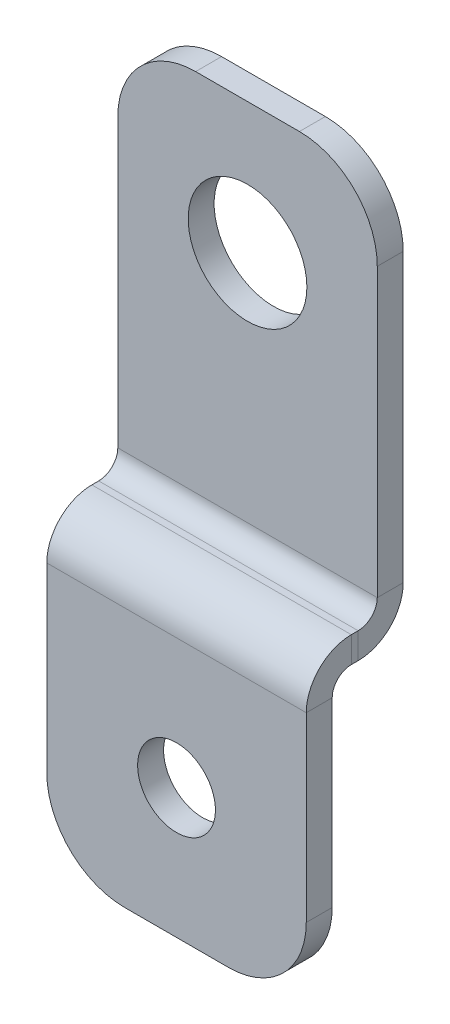
ISO-10303-21;
HEADER;
FILE_DESCRIPTION(('STEP AP214'),'2;1');
FILE_NAME('part.step','',(''),(''),'','','');
FILE_SCHEMA(('AUTOMOTIVE_DESIGN { 1 0 10303 214 1 1 1 1 }'));
ENDSEC;
DATA;
#1=APPLICATION_CONTEXT('core data for automotive mechanical design processes');
#2=APPLICATION_PROTOCOL_DEFINITION('international standard','automotive_design',2000,#1);
#3=PRODUCT_CONTEXT('',#1,'mechanical');
#4=PRODUCT('Part','Part','',(#3));
#5=PRODUCT_RELATED_PRODUCT_CATEGORY('part','',(#4));
#6=PRODUCT_DEFINITION_FORMATION('','',#4);
#7=PRODUCT_DEFINITION_CONTEXT('part definition',#1,'design');
#8=PRODUCT_DEFINITION('design','',#6,#7);
#9=PRODUCT_DEFINITION_SHAPE('','',#8);
#10=(LENGTH_UNIT() NAMED_UNIT(*) SI_UNIT(.MILLI.,.METRE.));
#11=(NAMED_UNIT(*) PLANE_ANGLE_UNIT() SI_UNIT($,.RADIAN.));
#12=(NAMED_UNIT(*) SI_UNIT($,.STERADIAN.) SOLID_ANGLE_UNIT());
#13=UNCERTAINTY_MEASURE_WITH_UNIT(LENGTH_MEASURE(1.E-05),#10,'distance_accuracy_value','');
#14=(GEOMETRIC_REPRESENTATION_CONTEXT(3) GLOBAL_UNCERTAINTY_ASSIGNED_CONTEXT((#13)) GLOBAL_UNIT_ASSIGNED_CONTEXT((#10,
#11,#12)) REPRESENTATION_CONTEXT('',''));
#15=CARTESIAN_POINT('',(0.,0.,0.));
#16=DIRECTION('',(0.,0.,1.));
#17=DIRECTION('',(1.,0.,0.));
#18=AXIS2_PLACEMENT_3D('',#15,#16,#17);
#19=CARTESIAN_POINT('',(0.,0.,1.));
#20=DIRECTION('',(0.,0.,1.));
#21=DIRECTION('',(1.,0.,0.));
#22=AXIS2_PLACEMENT_3D('',#19,#20,#21);
#23=PLANE('',#22);
#24=DIRECTION('',(-1.,0.,0.));
#25=VECTOR('',#24,1.);
#26=CARTESIAN_POINT('',(-514.974194852609,-14.350283508699,1.));
#27=LINE('',#26,#25);
#28=CARTESIAN_POINT('',(-507.974194852609,-14.350283508699,1.));
#29=VERTEX_POINT('',#28);
#30=CARTESIAN_POINT('',(-511.974194852609,-14.350283508699,1.));
#31=VERTEX_POINT('',#30);
#32=EDGE_CURVE('E306',#29,#31,#27,.T.);
#33=ORIENTED_EDGE('',*,*,#32,.T.);
#34=CARTESIAN_POINT('',(-511.974194852609,-17.350283508699,1.));
#35=DIRECTION('',(0.,0.,1.));
#36=DIRECTION('',(1.,0.,0.));
#37=AXIS2_PLACEMENT_3D('',#34,#35,#36);
#38=CIRCLE('',#37,3.);
#39=CARTESIAN_POINT('',(-514.974194852609,-17.350283508699,1.));
#40=VERTEX_POINT('',#39);
#41=EDGE_CURVE('E336',#31,#40,#38,.T.);
#42=ORIENTED_EDGE('',*,*,#41,.T.);
#43=DIRECTION('',(0.,-1.,0.));
#44=VECTOR('',#43,1.);
#45=CARTESIAN_POINT('',(-514.974194852609,-14.350283508699,1.));
#46=LINE('',#45,#44);
#47=CARTESIAN_POINT('',(-514.974194852609,-28.4078112950588,1.));
#48=VERTEX_POINT('',#47);
#49=EDGE_CURVE('E296',#40,#48,#46,.T.);
#50=ORIENTED_EDGE('',*,*,#49,.T.);
#51=DIRECTION('',(1.,0.,0.));
#52=VECTOR('',#51,1.);
#53=CARTESIAN_POINT('',(-514.974194852609,-28.4078112950588,1.));
#54=LINE('',#53,#52);
#55=CARTESIAN_POINT('',(-504.974194852609,-28.4078112950588,1.));
#56=VERTEX_POINT('',#55);
#57=EDGE_CURVE('E297',#48,#56,#54,.T.);
#58=ORIENTED_EDGE('',*,*,#57,.T.);
#59=DIRECTION('',(0.,1.,0.));
#60=VECTOR('',#59,1.);
#61=CARTESIAN_POINT('',(-504.974194852609,-14.350283508699,1.));
#62=LINE('',#61,#60);
#63=CARTESIAN_POINT('',(-504.974194852609,-17.350283508699,1.));
#64=VERTEX_POINT('',#63);
#65=EDGE_CURVE('E303',#56,#64,#62,.T.);
#66=ORIENTED_EDGE('',*,*,#65,.T.);
#67=CARTESIAN_POINT('',(-507.974194852609,-17.350283508699,1.));
#68=DIRECTION('',(0.,0.,1.));
#69=DIRECTION('',(1.,0.,0.));
#70=AXIS2_PLACEMENT_3D('',#67,#68,#69);
#71=CIRCLE('',#70,3.);
#72=EDGE_CURVE('E337',#64,#29,#71,.T.);
#73=ORIENTED_EDGE('',*,*,#72,.T.);
#74=EDGE_LOOP('',(#33,#42,#50,#58,#66,#73));
#75=FACE_BOUND('',#74,.T.);
#76=CARTESIAN_POINT('',(-509.974194852609,-19.4,1.));
#77=DIRECTION('',(0.,0.,1.));
#78=DIRECTION('',(1.,0.,0.));
#79=AXIS2_PLACEMENT_3D('',#76,#77,#78);
#80=CIRCLE('',#79,2.28730752562085);
#81=CARTESIAN_POINT('',(-507.686887326988,-19.4,1.));
#82=VERTEX_POINT('',#81);
#83=EDGE_CURVE('E292',#82,#82,#80,.T.);
#84=ORIENTED_EDGE('',*,*,#83,.F.);
#85=EDGE_LOOP('',(#84));
#86=FACE_BOUND('',#85,.T.);
#87=ADVANCED_FACE('F85',(#75,#86),#23,.T.);
#88=CARTESIAN_POINT('',(0.,0.,0.));
#89=DIRECTION('',(0.,0.,1.));
#90=DIRECTION('',(1.,0.,0.));
#91=AXIS2_PLACEMENT_3D('',#88,#89,#90);
#92=PLANE('',#91);
#93=DIRECTION('',(0.,-1.,0.));
#94=VECTOR('',#93,1.);
#95=CARTESIAN_POINT('',(-514.974194852609,-14.350283508699,0.));
#96=LINE('',#95,#94);
#97=CARTESIAN_POINT('',(-514.974194852609,-17.350283508699,0.));
#98=VERTEX_POINT('',#97);
#99=CARTESIAN_POINT('',(-514.974194852609,-28.4078112950588,0.));
#100=VERTEX_POINT('',#99);
#101=EDGE_CURVE('E294',#98,#100,#96,.T.);
#102=ORIENTED_EDGE('',*,*,#101,.F.);
#103=CARTESIAN_POINT('',(-511.974194852609,-17.350283508699,0.));
#104=DIRECTION('',(0.,0.,1.));
#105=DIRECTION('',(1.,0.,0.));
#106=AXIS2_PLACEMENT_3D('',#103,#104,#105);
#107=CIRCLE('',#106,3.);
#108=CARTESIAN_POINT('',(-511.974194852609,-14.350283508699,0.));
#109=VERTEX_POINT('',#108);
#110=EDGE_CURVE('E326',#98,#109,#107,.F.);
#111=ORIENTED_EDGE('',*,*,#110,.T.);
#112=DIRECTION('',(-1.,0.,0.));
#113=VECTOR('',#112,1.);
#114=CARTESIAN_POINT('',(-514.974194852609,-14.350283508699,0.));
#115=LINE('',#114,#113);
#116=CARTESIAN_POINT('',(-507.974194852609,-14.350283508699,0.));
#117=VERTEX_POINT('',#116);
#118=EDGE_CURVE('E301',#117,#109,#115,.T.);
#119=ORIENTED_EDGE('',*,*,#118,.F.);
#120=CARTESIAN_POINT('',(-507.974194852609,-17.350283508699,0.));
#121=DIRECTION('',(0.,0.,1.));
#122=DIRECTION('',(1.,0.,0.));
#123=AXIS2_PLACEMENT_3D('',#120,#121,#122);
#124=CIRCLE('',#123,3.);
#125=CARTESIAN_POINT('',(-504.974194852609,-17.350283508699,0.));
#126=VERTEX_POINT('',#125);
#127=EDGE_CURVE('E330',#117,#126,#124,.F.);
#128=ORIENTED_EDGE('',*,*,#127,.T.);
#129=DIRECTION('',(0.,1.,0.));
#130=VECTOR('',#129,1.);
#131=CARTESIAN_POINT('',(-504.974194852609,-14.350283508699,0.));
#132=LINE('',#131,#130);
#133=CARTESIAN_POINT('',(-504.974194852609,-28.4078112950588,0.));
#134=VERTEX_POINT('',#133);
#135=EDGE_CURVE('E313',#134,#126,#132,.T.);
#136=ORIENTED_EDGE('',*,*,#135,.F.);
#137=DIRECTION('',(1.,0.,0.));
#138=VECTOR('',#137,1.);
#139=CARTESIAN_POINT('',(-514.974194852609,-28.4078112950588,0.));
#140=LINE('',#139,#138);
#141=EDGE_CURVE('E311',#100,#134,#140,.T.);
#142=ORIENTED_EDGE('',*,*,#141,.F.);
#143=EDGE_LOOP('',(#102,#111,#119,#128,#136,#142));
#144=FACE_BOUND('',#143,.T.);
#145=CARTESIAN_POINT('',(-509.974194852609,-19.4,0.));
#146=DIRECTION('',(0.,0.,1.));
#147=DIRECTION('',(1.,0.,0.));
#148=AXIS2_PLACEMENT_3D('',#145,#146,#147);
#149=CIRCLE('',#148,2.28730752562085);
#150=CARTESIAN_POINT('',(-507.686887326988,-19.4,0.));
#151=VERTEX_POINT('',#150);
#152=EDGE_CURVE('E283',#151,#151,#149,.T.);
#153=ORIENTED_EDGE('',*,*,#152,.T.);
#154=EDGE_LOOP('',(#153));
#155=FACE_BOUND('',#154,.T.);
#156=ADVANCED_FACE('F426',(#144,#155),#92,.F.);
#157=CARTESIAN_POINT('',(-514.974194852609,-14.350283508699,1.));
#158=DIRECTION('',(1.,0.,0.));
#159=DIRECTION('',(0.,0.,-1.));
#160=AXIS2_PLACEMENT_3D('',#157,#158,#159);
#161=PLANE('',#160);
#162=ORIENTED_EDGE('',*,*,#49,.F.);
#163=DIRECTION('',(0.,0.,-1.));
#164=VECTOR('',#163,1.);
#165=CARTESIAN_POINT('',(-514.974194852609,-17.350283508699,1.));
#166=LINE('',#165,#164);
#167=EDGE_CURVE('E323',#40,#98,#166,.T.);
#168=ORIENTED_EDGE('',*,*,#167,.T.);
#169=ORIENTED_EDGE('',*,*,#101,.T.);
#170=DIRECTION('',(0.,0.,-1.));
#171=VECTOR('',#170,1.);
#172=CARTESIAN_POINT('',(-514.974194852609,-28.4078112950588,1.));
#173=LINE('',#172,#171);
#174=EDGE_CURVE('E324',#48,#100,#173,.T.);
#175=ORIENTED_EDGE('',*,*,#174,.F.);
#176=EDGE_LOOP('',(#162,#168,#169,#175));
#177=FACE_BOUND('',#176,.T.);
#178=ADVANCED_FACE('F399',(#177),#161,.F.);
#179=CARTESIAN_POINT('',(-504.974194852609,-14.350283508699,1.));
#180=DIRECTION('',(-1.,0.,0.));
#181=DIRECTION('',(0.,0.,1.));
#182=AXIS2_PLACEMENT_3D('',#179,#180,#181);
#183=PLANE('',#182);
#184=ORIENTED_EDGE('',*,*,#135,.T.);
#185=DIRECTION('',(0.,0.,-1.));
#186=VECTOR('',#185,1.);
#187=CARTESIAN_POINT('',(-504.974194852609,-17.350283508699,1.));
#188=LINE('',#187,#186);
#189=EDGE_CURVE('E338',#126,#64,#188,.F.);
#190=ORIENTED_EDGE('',*,*,#189,.T.);
#191=ORIENTED_EDGE('',*,*,#65,.F.);
#192=DIRECTION('',(0.,0.,-1.));
#193=VECTOR('',#192,1.);
#194=CARTESIAN_POINT('',(-504.974194852609,-28.4078112950588,1.));
#195=LINE('',#194,#193);
#196=EDGE_CURVE('E307',#56,#134,#195,.T.);
#197=ORIENTED_EDGE('',*,*,#196,.T.);
#198=EDGE_LOOP('',(#184,#190,#191,#197));
#199=FACE_BOUND('',#198,.T.);
#200=ADVANCED_FACE('F413',(#199),#183,.F.);
#201=CARTESIAN_POINT('',(-514.974194852609,-14.350283508699,1.));
#202=DIRECTION('',(0.,-1.,0.));
#203=DIRECTION('',(0.,0.,-1.));
#204=AXIS2_PLACEMENT_3D('',#201,#202,#203);
#205=PLANE('',#204);
#206=ORIENTED_EDGE('',*,*,#118,.T.);
#207=DIRECTION('',(0.,0.,-1.));
#208=VECTOR('',#207,1.);
#209=CARTESIAN_POINT('',(-511.974194852609,-14.350283508699,1.));
#210=LINE('',#209,#208);
#211=EDGE_CURVE('E333',#109,#31,#210,.F.);
#212=ORIENTED_EDGE('',*,*,#211,.T.);
#213=ORIENTED_EDGE('',*,*,#32,.F.);
#214=DIRECTION('',(0.,0.,-1.));
#215=VECTOR('',#214,1.);
#216=CARTESIAN_POINT('',(-507.974194852609,-14.350283508699,1.));
#217=LINE('',#216,#215);
#218=EDGE_CURVE('E331',#29,#117,#217,.T.);
#219=ORIENTED_EDGE('',*,*,#218,.T.);
#220=EDGE_LOOP('',(#206,#212,#213,#219));
#221=FACE_BOUND('',#220,.T.);
#222=ADVANCED_FACE('F440',(#221),#205,.F.);
#223=CARTESIAN_POINT('',(-509.974194852609,-19.4,1.));
#224=DIRECTION('',(0.,0.,-1.));
#225=DIRECTION('',(-1.,0.,0.));
#226=AXIS2_PLACEMENT_3D('',#223,#224,#225);
#227=CYLINDRICAL_SURFACE('',#226,2.28730752562085);
#228=ORIENTED_EDGE('',*,*,#83,.T.);
#229=EDGE_LOOP('',(#228));
#230=FACE_BOUND('',#229,.T.);
#231=ORIENTED_EDGE('',*,*,#152,.F.);
#232=EDGE_LOOP('',(#231));
#233=FACE_BOUND('',#232,.T.);
#234=ADVANCED_FACE('F425',(#230,#233),#227,.F.);
#235=CARTESIAN_POINT('',(-514.974194852609,-28.4078112950588,1.7366));
#236=DIRECTION('',(-1.,0.,0.));
#237=DIRECTION('',(0.,0.,1.));
#238=AXIS2_PLACEMENT_3D('',#235,#236,#237);
#239=PLANE('',#238);
#240=DIRECTION('',(0.,1.,0.));
#241=VECTOR('',#240,1.);
#242=CARTESIAN_POINT('',(-514.974194852609,-30.1444112950588,1.73659999999999));
#243=LINE('',#242,#241);
#244=CARTESIAN_POINT('',(-514.974194852609,-29.1444112950588,1.7366));
#245=VERTEX_POINT('',#244);
#246=CARTESIAN_POINT('',(-514.974194852609,-30.1444112950588,1.73659999999999));
#247=VERTEX_POINT('',#246);
#248=EDGE_CURVE('E246',#245,#247,#243,.F.);
#249=ORIENTED_EDGE('',*,*,#248,.F.);
#250=CARTESIAN_POINT('',(-514.974194852609,-28.4078112950588,1.7366));
#251=DIRECTION('',(1.,0.,0.));
#252=DIRECTION('',(0.,0.,-1.));
#253=AXIS2_PLACEMENT_3D('',#250,#251,#252);
#254=CIRCLE('',#253,0.7366);
#255=EDGE_CURVE('E289',#48,#245,#254,.F.);
#256=ORIENTED_EDGE('',*,*,#255,.F.);
#257=ORIENTED_EDGE('',*,*,#174,.T.);
#258=CARTESIAN_POINT('',(-514.974194852609,-28.4078112950588,1.7366));
#259=DIRECTION('',(1.,0.,0.));
#260=DIRECTION('',(0.,0.,-1.));
#261=AXIS2_PLACEMENT_3D('',#258,#259,#260);
#262=CIRCLE('',#261,1.7366);
#263=EDGE_CURVE('E278',#100,#247,#262,.F.);
#264=ORIENTED_EDGE('',*,*,#263,.T.);
#265=EDGE_LOOP('',(#249,#256,#257,#264));
#266=FACE_BOUND('',#265,.T.);
#267=ADVANCED_FACE('F391',(#266),#239,.T.);
#268=CARTESIAN_POINT('',(-504.974194852609,-28.4078112950588,1.7366));
#269=DIRECTION('',(-1.,0.,0.));
#270=DIRECTION('',(0.,0.,1.));
#271=AXIS2_PLACEMENT_3D('',#268,#269,#270);
#272=PLANE('',#271);
#273=CARTESIAN_POINT('',(-504.974194852609,-28.4078112950588,1.7366));
#274=DIRECTION('',(1.,0.,0.));
#275=DIRECTION('',(0.,0.,-1.));
#276=AXIS2_PLACEMENT_3D('',#273,#274,#275);
#277=CIRCLE('',#276,0.7366);
#278=CARTESIAN_POINT('',(-504.974194852609,-29.1444112950588,1.7366));
#279=VERTEX_POINT('',#278);
#280=EDGE_CURVE('E251',#279,#56,#277,.T.);
#281=ORIENTED_EDGE('',*,*,#280,.F.);
#282=DIRECTION('',(0.,1.,0.));
#283=VECTOR('',#282,1.);
#284=CARTESIAN_POINT('',(-504.974194852609,-29.1444112950588,1.7366));
#285=LINE('',#284,#283);
#286=CARTESIAN_POINT('',(-504.974194852609,-30.1444112950588,1.73659999999999));
#287=VERTEX_POINT('',#286);
#288=EDGE_CURVE('E271',#279,#287,#285,.F.);
#289=ORIENTED_EDGE('',*,*,#288,.T.);
#290=CARTESIAN_POINT('',(-504.974194852609,-28.4078112950588,1.7366));
#291=DIRECTION('',(1.,0.,0.));
#292=DIRECTION('',(0.,0.,-1.));
#293=AXIS2_PLACEMENT_3D('',#290,#291,#292);
#294=CIRCLE('',#293,1.7366);
#295=EDGE_CURVE('E284',#287,#134,#294,.T.);
#296=ORIENTED_EDGE('',*,*,#295,.T.);
#297=ORIENTED_EDGE('',*,*,#196,.F.);
#298=EDGE_LOOP('',(#281,#289,#296,#297));
#299=FACE_BOUND('',#298,.T.);
#300=ADVANCED_FACE('F417',(#299),#272,.F.);
#301=CARTESIAN_POINT('',(-504.974194852609,-28.4078112950588,1.7366));
#302=DIRECTION('',(1.,0.,0.));
#303=DIRECTION('',(0.,-1.,0.));
#304=AXIS2_PLACEMENT_3D('',#301,#302,#303);
#305=CYLINDRICAL_SURFACE('',#304,1.7366);
#306=ORIENTED_EDGE('',*,*,#141,.T.);
#307=ORIENTED_EDGE('',*,*,#295,.F.);
#308=DIRECTION('',(1.,0.,0.));
#309=VECTOR('',#308,1.);
#310=CARTESIAN_POINT('',(-514.974194852609,-30.1444112950588,1.73659999999999));
#311=LINE('',#310,#309);
#312=EDGE_CURVE('E272',#287,#247,#311,.F.);
#313=ORIENTED_EDGE('',*,*,#312,.T.);
#314=ORIENTED_EDGE('',*,*,#263,.F.);
#315=EDGE_LOOP('',(#306,#307,#313,#314));
#316=FACE_BOUND('',#315,.T.);
#317=ADVANCED_FACE('F395',(#316),#305,.T.);
#318=CARTESIAN_POINT('',(-504.974194852609,-28.4078112950588,1.7366));
#319=DIRECTION('',(1.,0.,0.));
#320=DIRECTION('',(0.,-1.,0.));
#321=AXIS2_PLACEMENT_3D('',#318,#319,#320);
#322=CYLINDRICAL_SURFACE('',#321,0.7366);
#323=ORIENTED_EDGE('',*,*,#57,.F.);
#324=ORIENTED_EDGE('',*,*,#255,.T.);
#325=DIRECTION('',(1.,0.,0.));
#326=VECTOR('',#325,1.);
#327=CARTESIAN_POINT('',(-514.974194852609,-29.1444112950588,1.7366));
#328=LINE('',#327,#326);
#329=EDGE_CURVE('E277',#245,#279,#328,.T.);
#330=ORIENTED_EDGE('',*,*,#329,.T.);
#331=ORIENTED_EDGE('',*,*,#280,.T.);
#332=EDGE_LOOP('',(#323,#324,#330,#331));
#333=FACE_BOUND('',#332,.T.);
#334=ADVANCED_FACE('F403',(#333),#322,.F.);
#335=CARTESIAN_POINT('',(-514.974194852609,-30.1444112950588,0.999999999999997));
#336=DIRECTION('',(1.,0.,0.));
#337=DIRECTION('',(0.,0.,-1.));
#338=AXIS2_PLACEMENT_3D('',#335,#336,#337);
#339=PLANE('',#338);
#340=ORIENTED_EDGE('',*,*,#248,.T.);
#341=DIRECTION('',(0.,0.,-1.));
#342=VECTOR('',#341,1.);
#343=CARTESIAN_POINT('',(-514.974194852609,-30.1444112950588,-1.02050875648158E-13));
#344=LINE('',#343,#342);
#345=CARTESIAN_POINT('',(-514.974194852609,-30.1444112950588,2.));
#346=VERTEX_POINT('',#345);
#347=EDGE_CURVE('E265',#346,#247,#344,.T.);
#348=ORIENTED_EDGE('',*,*,#347,.F.);
#349=DIRECTION('',(0.,1.,0.));
#350=VECTOR('',#349,1.);
#351=CARTESIAN_POINT('',(-514.974194852609,-30.1444112950588,2.));
#352=LINE('',#351,#350);
#353=CARTESIAN_POINT('',(-514.974194852609,-29.1444112950588,2.));
#354=VERTEX_POINT('',#353);
#355=EDGE_CURVE('E253',#346,#354,#352,.T.);
#356=ORIENTED_EDGE('',*,*,#355,.T.);
#357=DIRECTION('',(0.,0.,1.));
#358=VECTOR('',#357,1.);
#359=CARTESIAN_POINT('',(-514.974194852609,-29.1444112950588,1.));
#360=LINE('',#359,#358);
#361=EDGE_CURVE('E267',#354,#245,#360,.F.);
#362=ORIENTED_EDGE('',*,*,#361,.T.);
#363=EDGE_LOOP('',(#340,#348,#356,#362));
#364=FACE_BOUND('',#363,.T.);
#365=ADVANCED_FACE('F389',(#364),#339,.F.);
#366=CARTESIAN_POINT('',(-504.974194852609,-30.1444112950588,2.));
#367=DIRECTION('',(-1.,0.,0.));
#368=DIRECTION('',(0.,0.,1.));
#369=AXIS2_PLACEMENT_3D('',#366,#367,#368);
#370=PLANE('',#369);
#371=ORIENTED_EDGE('',*,*,#288,.F.);
#372=DIRECTION('',(0.,0.,-1.));
#373=VECTOR('',#372,1.);
#374=CARTESIAN_POINT('',(-504.974194852609,-29.1444112950588,2.));
#375=LINE('',#374,#373);
#376=CARTESIAN_POINT('',(-504.974194852609,-29.1444112950588,2.));
#377=VERTEX_POINT('',#376);
#378=EDGE_CURVE('E266',#279,#377,#375,.F.);
#379=ORIENTED_EDGE('',*,*,#378,.T.);
#380=DIRECTION('',(0.,1.,0.));
#381=VECTOR('',#380,1.);
#382=CARTESIAN_POINT('',(-504.974194852609,-30.1444112950588,2.));
#383=LINE('',#382,#381);
#384=CARTESIAN_POINT('',(-504.974194852609,-30.1444112950588,2.));
#385=VERTEX_POINT('',#384);
#386=EDGE_CURVE('E252',#385,#377,#383,.T.);
#387=ORIENTED_EDGE('',*,*,#386,.F.);
#388=DIRECTION('',(0.,0.,1.));
#389=VECTOR('',#388,1.);
#390=CARTESIAN_POINT('',(-504.974194852609,-30.1444112950588,-1.02050875648158E-13));
#391=LINE('',#390,#389);
#392=EDGE_CURVE('E257',#287,#385,#391,.T.);
#393=ORIENTED_EDGE('',*,*,#392,.F.);
#394=EDGE_LOOP('',(#371,#379,#387,#393));
#395=FACE_BOUND('',#394,.T.);
#396=ADVANCED_FACE('F378',(#395),#370,.F.);
#397=CARTESIAN_POINT('',(0.,-30.1444112950588,-1.02050875648158E-13));
#398=DIRECTION('',(0.,1.,0.));
#399=DIRECTION('',(0.,0.,1.));
#400=AXIS2_PLACEMENT_3D('',#397,#398,#399);
#401=PLANE('',#400);
#402=ORIENTED_EDGE('',*,*,#312,.F.);
#403=ORIENTED_EDGE('',*,*,#392,.T.);
#404=DIRECTION('',(-1.,0.,0.));
#405=VECTOR('',#404,1.);
#406=CARTESIAN_POINT('',(0.,-30.1444112950588,2.));
#407=LINE('',#406,#405);
#408=EDGE_CURVE('E260',#385,#346,#407,.T.);
#409=ORIENTED_EDGE('',*,*,#408,.T.);
#410=ORIENTED_EDGE('',*,*,#347,.T.);
#411=EDGE_LOOP('',(#402,#403,#409,#410));
#412=FACE_BOUND('',#411,.T.);
#413=ADVANCED_FACE('F388',(#412),#401,.F.);
#414=CARTESIAN_POINT('',(0.,-29.1444112950588,0.));
#415=DIRECTION('',(0.,1.,0.));
#416=DIRECTION('',(0.,0.,1.));
#417=AXIS2_PLACEMENT_3D('',#414,#415,#416);
#418=PLANE('',#417);
#419=ORIENTED_EDGE('',*,*,#378,.F.);
#420=ORIENTED_EDGE('',*,*,#329,.F.);
#421=ORIENTED_EDGE('',*,*,#361,.F.);
#422=DIRECTION('',(1.,0.,0.));
#423=VECTOR('',#422,1.);
#424=CARTESIAN_POINT('',(-514.974194852609,-29.1444112950588,2.));
#425=LINE('',#424,#423);
#426=EDGE_CURVE('E207',#377,#354,#425,.F.);
#427=ORIENTED_EDGE('',*,*,#426,.F.);
#428=EDGE_LOOP('',(#419,#420,#421,#427));
#429=FACE_BOUND('',#428,.T.);
#430=ADVANCED_FACE('F384',(#429),#418,.T.);
#431=CARTESIAN_POINT('',(-504.974194852609,-30.8810112950588,2.));
#432=DIRECTION('',(1.,0.,0.));
#433=DIRECTION('',(0.,0.,-1.));
#434=AXIS2_PLACEMENT_3D('',#431,#432,#433);
#435=PLANE('',#434);
#436=DIRECTION('',(0.,0.,-1.));
#437=VECTOR('',#436,1.);
#438=CARTESIAN_POINT('',(-504.974194852609,-30.8810112950588,3.7366));
#439=LINE('',#438,#437);
#440=CARTESIAN_POINT('',(-504.974194852609,-30.8810112950588,2.7366));
#441=VERTEX_POINT('',#440);
#442=CARTESIAN_POINT('',(-504.974194852609,-30.8810112950588,3.7366));
#443=VERTEX_POINT('',#442);
#444=EDGE_CURVE('E245',#441,#443,#439,.F.);
#445=ORIENTED_EDGE('',*,*,#444,.F.);
#446=CARTESIAN_POINT('',(-504.974194852609,-30.8810112950588,2.));
#447=DIRECTION('',(-1.,0.,0.));
#448=DIRECTION('',(0.,0.,1.));
#449=AXIS2_PLACEMENT_3D('',#446,#447,#448);
#450=CIRCLE('',#449,0.7366);
#451=EDGE_CURVE('E208',#385,#441,#450,.F.);
#452=ORIENTED_EDGE('',*,*,#451,.F.);
#453=ORIENTED_EDGE('',*,*,#386,.T.);
#454=CARTESIAN_POINT('',(-504.974194852609,-30.8810112950588,2.));
#455=DIRECTION('',(-1.,0.,0.));
#456=DIRECTION('',(0.,0.,1.));
#457=AXIS2_PLACEMENT_3D('',#454,#455,#456);
#458=CIRCLE('',#457,1.7366);
#459=EDGE_CURVE('E209',#377,#443,#458,.F.);
#460=ORIENTED_EDGE('',*,*,#459,.T.);
#461=EDGE_LOOP('',(#445,#452,#453,#460));
#462=FACE_BOUND('',#461,.T.);
#463=ADVANCED_FACE('F372',(#462),#435,.T.);
#464=CARTESIAN_POINT('',(-514.974194852609,-30.8810112950588,2.));
#465=DIRECTION('',(1.,0.,0.));
#466=DIRECTION('',(0.,0.,-1.));
#467=AXIS2_PLACEMENT_3D('',#464,#465,#466);
#468=PLANE('',#467);
#469=CARTESIAN_POINT('',(-514.974194852609,-30.8810112950588,2.));
#470=DIRECTION('',(-1.,0.,0.));
#471=DIRECTION('',(0.,0.,1.));
#472=AXIS2_PLACEMENT_3D('',#469,#470,#471);
#473=CIRCLE('',#472,0.7366);
#474=CARTESIAN_POINT('',(-514.974194852609,-30.8810112950588,2.7366));
#475=VERTEX_POINT('',#474);
#476=EDGE_CURVE('E220',#475,#346,#473,.T.);
#477=ORIENTED_EDGE('',*,*,#476,.F.);
#478=DIRECTION('',(0.,0.,-1.));
#479=VECTOR('',#478,1.);
#480=CARTESIAN_POINT('',(-514.974194852609,-30.8810112950588,2.7366));
#481=LINE('',#480,#479);
#482=CARTESIAN_POINT('',(-514.974194852609,-30.8810112950588,3.7366));
#483=VERTEX_POINT('',#482);
#484=EDGE_CURVE('E211',#475,#483,#481,.F.);
#485=ORIENTED_EDGE('',*,*,#484,.T.);
#486=CARTESIAN_POINT('',(-514.974194852609,-30.8810112950588,2.));
#487=DIRECTION('',(-1.,0.,0.));
#488=DIRECTION('',(0.,0.,1.));
#489=AXIS2_PLACEMENT_3D('',#486,#487,#488);
#490=CIRCLE('',#489,1.7366);
#491=EDGE_CURVE('E199',#483,#354,#490,.T.);
#492=ORIENTED_EDGE('',*,*,#491,.T.);
#493=ORIENTED_EDGE('',*,*,#355,.F.);
#494=EDGE_LOOP('',(#477,#485,#492,#493));
#495=FACE_BOUND('',#494,.T.);
#496=ADVANCED_FACE('F213',(#495),#468,.F.);
#497=CARTESIAN_POINT('',(-514.974194852609,-30.8810112950588,2.));
#498=DIRECTION('',(-1.,0.,0.));
#499=DIRECTION('',(0.,0.,1.));
#500=AXIS2_PLACEMENT_3D('',#497,#498,#499);
#501=CYLINDRICAL_SURFACE('',#500,1.7366);
#502=ORIENTED_EDGE('',*,*,#426,.T.);
#503=ORIENTED_EDGE('',*,*,#491,.F.);
#504=DIRECTION('',(-1.,0.,0.));
#505=VECTOR('',#504,1.);
#506=CARTESIAN_POINT('',(-504.974194852609,-30.8810112950588,3.7366));
#507=LINE('',#506,#505);
#508=EDGE_CURVE('E202',#483,#443,#507,.F.);
#509=ORIENTED_EDGE('',*,*,#508,.T.);
#510=ORIENTED_EDGE('',*,*,#459,.F.);
#511=EDGE_LOOP('',(#502,#503,#509,#510));
#512=FACE_BOUND('',#511,.T.);
#513=ADVANCED_FACE('F198',(#512),#501,.T.);
#514=CARTESIAN_POINT('',(-514.974194852609,-30.8810112950588,2.));
#515=DIRECTION('',(-1.,0.,0.));
#516=DIRECTION('',(0.,0.,1.));
#517=AXIS2_PLACEMENT_3D('',#514,#515,#516);
#518=CYLINDRICAL_SURFACE('',#517,0.7366);
#519=ORIENTED_EDGE('',*,*,#408,.F.);
#520=ORIENTED_EDGE('',*,*,#451,.T.);
#521=DIRECTION('',(-1.,0.,0.));
#522=VECTOR('',#521,1.);
#523=CARTESIAN_POINT('',(-504.974194852609,-30.8810112950588,2.7366));
#524=LINE('',#523,#522);
#525=EDGE_CURVE('E219',#441,#475,#524,.T.);
#526=ORIENTED_EDGE('',*,*,#525,.T.);
#527=ORIENTED_EDGE('',*,*,#476,.T.);
#528=EDGE_LOOP('',(#519,#520,#526,#527));
#529=FACE_BOUND('',#528,.T.);
#530=ADVANCED_FACE('F371',(#529),#518,.F.);
#531=CARTESIAN_POINT('',(-504.974194852609,-30.1444112950588,3.7366));
#532=DIRECTION('',(-1.,0.,0.));
#533=DIRECTION('',(0.,0.,1.));
#534=AXIS2_PLACEMENT_3D('',#531,#532,#533);
#535=PLANE('',#534);
#536=DIRECTION('',(0.,1.,0.));
#537=VECTOR('',#536,1.);
#538=CARTESIAN_POINT('',(-504.974194852609,0.,3.7366));
#539=LINE('',#538,#537);
#540=CARTESIAN_POINT('',(-504.974194852609,-37.8810112950588,3.7366));
#541=VERTEX_POINT('',#540);
#542=EDGE_CURVE('E228',#541,#443,#539,.T.);
#543=ORIENTED_EDGE('',*,*,#542,.F.);
#544=DIRECTION('',(0.,0.,-1.));
#545=VECTOR('',#544,1.);
#546=CARTESIAN_POINT('',(-504.974194852609,-37.8810112950588,3.7366));
#547=LINE('',#546,#545);
#548=CARTESIAN_POINT('',(-504.974194852609,-37.8810112950588,2.7366));
#549=VERTEX_POINT('',#548);
#550=EDGE_CURVE('E345',#541,#549,#547,.T.);
#551=ORIENTED_EDGE('',*,*,#550,.T.);
#552=DIRECTION('',(0.,-1.,0.));
#553=VECTOR('',#552,1.);
#554=CARTESIAN_POINT('',(-504.974194852609,-30.1444112950588,2.7366));
#555=LINE('',#554,#553);
#556=EDGE_CURVE('E227',#549,#441,#555,.F.);
#557=ORIENTED_EDGE('',*,*,#556,.T.);
#558=ORIENTED_EDGE('',*,*,#444,.T.);
#559=EDGE_LOOP('',(#543,#551,#557,#558));
#560=FACE_BOUND('',#559,.T.);
#561=ADVANCED_FACE('F356',(#560),#535,.F.);
#562=CARTESIAN_POINT('',(-514.974194852609,-40.8810112950588,3.7366));
#563=DIRECTION('',(1.,0.,0.));
#564=DIRECTION('',(0.,0.,-1.));
#565=AXIS2_PLACEMENT_3D('',#562,#563,#564);
#566=PLANE('',#565);
#567=DIRECTION('',(0.,1.,0.));
#568=VECTOR('',#567,1.);
#569=CARTESIAN_POINT('',(-514.974194852609,-40.8810112950588,2.7366));
#570=LINE('',#569,#568);
#571=CARTESIAN_POINT('',(-514.974194852609,-37.8810112950588,2.7366));
#572=VERTEX_POINT('',#571);
#573=EDGE_CURVE('E238',#475,#572,#570,.F.);
#574=ORIENTED_EDGE('',*,*,#573,.T.);
#575=DIRECTION('',(0.,0.,-1.));
#576=VECTOR('',#575,1.);
#577=CARTESIAN_POINT('',(-514.974194852609,-37.8810112950588,3.7366));
#578=LINE('',#577,#576);
#579=CARTESIAN_POINT('',(-514.974194852609,-37.8810112950588,3.7366));
#580=VERTEX_POINT('',#579);
#581=EDGE_CURVE('E13',#572,#580,#578,.F.);
#582=ORIENTED_EDGE('',*,*,#581,.T.);
#583=DIRECTION('',(0.,-1.,0.));
#584=VECTOR('',#583,1.);
#585=CARTESIAN_POINT('',(-514.974194852609,0.,3.7366));
#586=LINE('',#585,#584);
#587=EDGE_CURVE('E225',#483,#580,#586,.T.);
#588=ORIENTED_EDGE('',*,*,#587,.F.);
#589=ORIENTED_EDGE('',*,*,#484,.F.);
#590=EDGE_LOOP('',(#574,#582,#588,#589));
#591=FACE_BOUND('',#590,.T.);
#592=ADVANCED_FACE('F230',(#591),#566,.F.);
#593=CARTESIAN_POINT('',(0.,0.,3.7366));
#594=DIRECTION('',(0.,0.,-1.));
#595=DIRECTION('',(0.,1.,0.));
#596=AXIS2_PLACEMENT_3D('',#593,#594,#595);
#597=PLANE('',#596);
#598=CARTESIAN_POINT('',(-509.974194852609,-35.8810112950589,3.7366));
#599=DIRECTION('',(0.,0.,-1.));
#600=DIRECTION('',(0.,1.,0.));
#601=AXIS2_PLACEMENT_3D('',#598,#599,#600);
#602=CIRCLE('',#601,1.49999999999997);
#603=CARTESIAN_POINT('',(-509.974194852609,-34.3810112950589,3.7366));
#604=VERTEX_POINT('',#603);
#605=EDGE_CURVE('E244',#604,#604,#602,.T.);
#606=ORIENTED_EDGE('',*,*,#605,.T.);
#607=EDGE_LOOP('',(#606));
#608=FACE_BOUND('',#607,.T.);
#609=DIRECTION('',(1.,0.,0.));
#610=VECTOR('',#609,1.);
#611=CARTESIAN_POINT('',(0.,-40.8810112950588,3.7366));
#612=LINE('',#611,#610);
#613=CARTESIAN_POINT('',(-511.974194852609,-40.8810112950588,3.7366));
#614=VERTEX_POINT('',#613);
#615=CARTESIAN_POINT('',(-507.974194852609,-40.8810112950588,3.7366));
#616=VERTEX_POINT('',#615);
#617=EDGE_CURVE('E229',#614,#616,#612,.T.);
#618=ORIENTED_EDGE('',*,*,#617,.T.);
#619=CARTESIAN_POINT('',(-507.974194852609,-37.8810112950588,3.7366));
#620=DIRECTION('',(0.,0.,-1.));
#621=DIRECTION('',(0.,1.,0.));
#622=AXIS2_PLACEMENT_3D('',#619,#620,#621);
#623=CIRCLE('',#622,3.);
#624=EDGE_CURVE('E86',#616,#541,#623,.F.);
#625=ORIENTED_EDGE('',*,*,#624,.T.);
#626=ORIENTED_EDGE('',*,*,#542,.T.);
#627=ORIENTED_EDGE('',*,*,#508,.F.);
#628=ORIENTED_EDGE('',*,*,#587,.T.);
#629=CARTESIAN_POINT('',(-511.974194852609,-37.8810112950588,3.7366));
#630=DIRECTION('',(0.,0.,-1.));
#631=DIRECTION('',(0.,1.,0.));
#632=AXIS2_PLACEMENT_3D('',#629,#630,#631);
#633=CIRCLE('',#632,3.);
#634=EDGE_CURVE('E355',#580,#614,#633,.F.);
#635=ORIENTED_EDGE('',*,*,#634,.T.);
#636=EDGE_LOOP('',(#618,#625,#626,#627,#628,#635));
#637=FACE_BOUND('',#636,.T.);
#638=ADVANCED_FACE('F224',(#608,#637),#597,.F.);
#639=CARTESIAN_POINT('',(0.,0.,2.7366));
#640=DIRECTION('',(0.,0.,-1.));
#641=DIRECTION('',(0.,1.,0.));
#642=AXIS2_PLACEMENT_3D('',#639,#640,#641);
#643=PLANE('',#642);
#644=CARTESIAN_POINT('',(-509.974194852609,-35.8810112950589,2.7366));
#645=DIRECTION('',(0.,0.,-1.));
#646=DIRECTION('',(-1.,0.,0.));
#647=AXIS2_PLACEMENT_3D('',#644,#645,#646);
#648=CIRCLE('',#647,1.49999999999997);
#649=CARTESIAN_POINT('',(-511.474194852609,-35.8810112950589,2.7366));
#650=VERTEX_POINT('',#649);
#651=EDGE_CURVE('E709',#650,#650,#648,.T.);
#652=ORIENTED_EDGE('',*,*,#651,.F.);
#653=EDGE_LOOP('',(#652));
#654=FACE_BOUND('',#653,.T.);
#655=ORIENTED_EDGE('',*,*,#556,.F.);
#656=CARTESIAN_POINT('',(-507.974194852609,-37.8810112950588,2.7366));
#657=DIRECTION('',(0.,0.,-1.));
#658=DIRECTION('',(0.,1.,0.));
#659=AXIS2_PLACEMENT_3D('',#656,#657,#658);
#660=CIRCLE('',#659,3.);
#661=CARTESIAN_POINT('',(-507.974194852609,-40.8810112950588,2.7366));
#662=VERTEX_POINT('',#661);
#663=EDGE_CURVE('E350',#549,#662,#660,.T.);
#664=ORIENTED_EDGE('',*,*,#663,.T.);
#665=DIRECTION('',(-1.,0.,0.));
#666=VECTOR('',#665,1.);
#667=CARTESIAN_POINT('',(-504.974194852609,-40.8810112950588,2.7366));
#668=LINE('',#667,#666);
#669=CARTESIAN_POINT('',(-511.974194852609,-40.8810112950588,2.7366));
#670=VERTEX_POINT('',#669);
#671=EDGE_CURVE('E231',#670,#662,#668,.F.);
#672=ORIENTED_EDGE('',*,*,#671,.F.);
#673=CARTESIAN_POINT('',(-511.974194852609,-37.8810112950588,2.7366));
#674=DIRECTION('',(0.,0.,-1.));
#675=DIRECTION('',(0.,1.,0.));
#676=AXIS2_PLACEMENT_3D('',#673,#674,#675);
#677=CIRCLE('',#676,3.);
#678=EDGE_CURVE('E343',#670,#572,#677,.T.);
#679=ORIENTED_EDGE('',*,*,#678,.T.);
#680=ORIENTED_EDGE('',*,*,#573,.F.);
#681=ORIENTED_EDGE('',*,*,#525,.F.);
#682=EDGE_LOOP('',(#655,#664,#672,#679,#680,#681));
#683=FACE_BOUND('',#682,.T.);
#684=ADVANCED_FACE('F364',(#654,#683),#643,.T.);
#685=CARTESIAN_POINT('',(-504.974194852609,-40.8810112950588,3.7366));
#686=DIRECTION('',(0.,1.,0.));
#687=DIRECTION('',(0.,0.,1.));
#688=AXIS2_PLACEMENT_3D('',#685,#686,#687);
#689=PLANE('',#688);
#690=ORIENTED_EDGE('',*,*,#671,.T.);
#691=DIRECTION('',(0.,0.,-1.));
#692=VECTOR('',#691,1.);
#693=CARTESIAN_POINT('',(-507.974194852609,-40.8810112950588,3.7366));
#694=LINE('',#693,#692);
#695=EDGE_CURVE('E101',#662,#616,#694,.F.);
#696=ORIENTED_EDGE('',*,*,#695,.T.);
#697=ORIENTED_EDGE('',*,*,#617,.F.);
#698=DIRECTION('',(0.,0.,-1.));
#699=VECTOR('',#698,1.);
#700=CARTESIAN_POINT('',(-511.974194852609,-40.8810112950588,3.7366));
#701=LINE('',#700,#699);
#702=EDGE_CURVE('E349',#614,#670,#701,.T.);
#703=ORIENTED_EDGE('',*,*,#702,.T.);
#704=EDGE_LOOP('',(#690,#696,#697,#703));
#705=FACE_BOUND('',#704,.T.);
#706=ADVANCED_FACE('F366',(#705),#689,.F.);
#707=CARTESIAN_POINT('',(-509.974194852609,-35.8810112950589,4.7366));
#708=DIRECTION('',(0.,0.,-1.));
#709=DIRECTION('',(-1.,0.,0.));
#710=AXIS2_PLACEMENT_3D('',#707,#708,#709);
#711=CYLINDRICAL_SURFACE('',#710,1.49999999999997);
#712=ORIENTED_EDGE('',*,*,#651,.T.);
#713=EDGE_LOOP('',(#712));
#714=FACE_BOUND('',#713,.T.);
#715=ORIENTED_EDGE('',*,*,#605,.F.);
#716=EDGE_LOOP('',(#715));
#717=FACE_BOUND('',#716,.T.);
#718=ADVANCED_FACE('F446',(#714,#717),#711,.F.);
#719=CARTESIAN_POINT('',(-511.974194852609,-17.350283508699,1.));
#720=DIRECTION('',(0.,0.,-1.));
#721=DIRECTION('',(-1.,0.,0.));
#722=AXIS2_PLACEMENT_3D('',#719,#720,#721);
#723=CYLINDRICAL_SURFACE('',#722,3.);
#724=ORIENTED_EDGE('',*,*,#41,.F.);
#725=ORIENTED_EDGE('',*,*,#211,.F.);
#726=ORIENTED_EDGE('',*,*,#110,.F.);
#727=ORIENTED_EDGE('',*,*,#167,.F.);
#728=EDGE_LOOP('',(#724,#725,#726,#727));
#729=FACE_BOUND('',#728,.T.);
#730=ADVANCED_FACE('F444',(#729),#723,.T.);
#731=CARTESIAN_POINT('',(-507.974194852609,-17.350283508699,1.));
#732=DIRECTION('',(0.,0.,-1.));
#733=DIRECTION('',(-1.,0.,0.));
#734=AXIS2_PLACEMENT_3D('',#731,#732,#733);
#735=CYLINDRICAL_SURFACE('',#734,3.);
#736=ORIENTED_EDGE('',*,*,#72,.F.);
#737=ORIENTED_EDGE('',*,*,#189,.F.);
#738=ORIENTED_EDGE('',*,*,#127,.F.);
#739=ORIENTED_EDGE('',*,*,#218,.F.);
#740=EDGE_LOOP('',(#736,#737,#738,#739));
#741=FACE_BOUND('',#740,.T.);
#742=ADVANCED_FACE('F449',(#741),#735,.T.);
#743=CARTESIAN_POINT('',(-507.974194852609,-37.8810112950588,3.7366));
#744=DIRECTION('',(0.,0.,-1.));
#745=DIRECTION('',(0.,1.,0.));
#746=AXIS2_PLACEMENT_3D('',#743,#744,#745);
#747=CYLINDRICAL_SURFACE('',#746,3.);
#748=ORIENTED_EDGE('',*,*,#624,.F.);
#749=ORIENTED_EDGE('',*,*,#695,.F.);
#750=ORIENTED_EDGE('',*,*,#663,.F.);
#751=ORIENTED_EDGE('',*,*,#550,.F.);
#752=EDGE_LOOP('',(#748,#749,#750,#751));
#753=FACE_BOUND('',#752,.T.);
#754=ADVANCED_FACE('F363',(#753),#747,.T.);
#755=CARTESIAN_POINT('',(-511.974194852609,-37.8810112950588,3.7366));
#756=DIRECTION('',(0.,0.,-1.));
#757=DIRECTION('',(0.,1.,0.));
#758=AXIS2_PLACEMENT_3D('',#755,#756,#757);
#759=CYLINDRICAL_SURFACE('',#758,3.);
#760=ORIENTED_EDGE('',*,*,#634,.F.);
#761=ORIENTED_EDGE('',*,*,#581,.F.);
#762=ORIENTED_EDGE('',*,*,#678,.F.);
#763=ORIENTED_EDGE('',*,*,#702,.F.);
#764=EDGE_LOOP('',(#760,#761,#762,#763));
#765=FACE_BOUND('',#764,.T.);
#766=ADVANCED_FACE('F81',(#765),#759,.T.);
#767=CLOSED_SHELL('',(#87,#156,#178,#200,#222,#234,#267,#300,#317,#334,#365,#396,#413,#430,#463,
#496,#513,#530,#561,#592,#638,#684,#706,#718,#730,#742,#754,#766));
#768=MANIFOLD_SOLID_BREP('B2',#767);
#769=ADVANCED_BREP_SHAPE_REPRESENTATION('',(#18,#768),#14);
#770=SHAPE_DEFINITION_REPRESENTATION(#9,#769);
ENDSEC;
END-ISO-10303-21;
